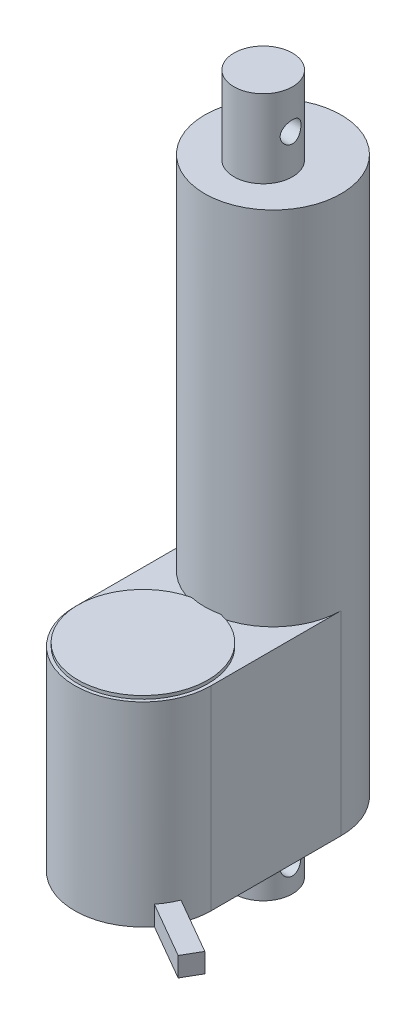
ISO-10303-21;
HEADER;
FILE_DESCRIPTION(('STEP AP214'),'2;1');
FILE_NAME('part.step','',(''),(''),'','','');
FILE_SCHEMA(('AUTOMOTIVE_DESIGN { 1 0 10303 214 1 1 1 1 }'));
ENDSEC;
DATA;
#1=APPLICATION_CONTEXT('core data for automotive mechanical design processes');
#2=APPLICATION_PROTOCOL_DEFINITION('international standard','automotive_design',2000,#1);
#3=PRODUCT_CONTEXT('',#1,'mechanical');
#4=PRODUCT('Part','Part','',(#3));
#5=PRODUCT_RELATED_PRODUCT_CATEGORY('part','',(#4));
#6=PRODUCT_DEFINITION_FORMATION('','',#4);
#7=PRODUCT_DEFINITION_CONTEXT('part definition',#1,'design');
#8=PRODUCT_DEFINITION('design','',#6,#7);
#9=PRODUCT_DEFINITION_SHAPE('','',#8);
#10=(LENGTH_UNIT() NAMED_UNIT(*) SI_UNIT(.MILLI.,.METRE.));
#11=(NAMED_UNIT(*) PLANE_ANGLE_UNIT() SI_UNIT($,.RADIAN.));
#12=(NAMED_UNIT(*) SI_UNIT($,.STERADIAN.) SOLID_ANGLE_UNIT());
#13=UNCERTAINTY_MEASURE_WITH_UNIT(LENGTH_MEASURE(1.E-05),#10,'distance_accuracy_value','');
#14=(GEOMETRIC_REPRESENTATION_CONTEXT(3) GLOBAL_UNCERTAINTY_ASSIGNED_CONTEXT((#13)) GLOBAL_UNIT_ASSIGNED_CONTEXT((#10,
#11,#12)) REPRESENTATION_CONTEXT('',''));
#15=CARTESIAN_POINT('',(0.,0.,0.));
#16=DIRECTION('',(0.,0.,1.));
#17=DIRECTION('',(1.,0.,0.));
#18=AXIS2_PLACEMENT_3D('',#15,#16,#17);
#19=CARTESIAN_POINT('',(0.,61.,40.));
#20=DIRECTION('',(0.,-1.,0.));
#21=DIRECTION('',(0.,0.,-1.));
#22=AXIS2_PLACEMENT_3D('',#19,#20,#21);
#23=CYLINDRICAL_SURFACE('',#22,20.);
#24=DIRECTION('',(0.,-1.,0.));
#25=VECTOR('',#24,1.);
#26=CARTESIAN_POINT('',(4.49859353020479,60.5000000000001,20.5125));
#27=LINE('',#26,#25);
#28=CARTESIAN_POINT('',(4.49859353020479,61.,20.5125));
#29=VERTEX_POINT('',#28);
#30=CARTESIAN_POINT('',(4.49859353020479,60.,20.5125));
#31=VERTEX_POINT('',#30);
#32=EDGE_CURVE('E168',#29,#31,#27,.T.);
#33=ORIENTED_EDGE('',*,*,#32,.F.);
#34=CARTESIAN_POINT('',(0.,61.,40.));
#35=DIRECTION('',(0.,1.,0.));
#36=DIRECTION('',(0.,0.,1.));
#37=AXIS2_PLACEMENT_3D('',#34,#35,#36);
#38=CIRCLE('',#37,20.);
#39=CARTESIAN_POINT('',(-4.49859353020478,61.,20.5125));
#40=VERTEX_POINT('',#39);
#41=EDGE_CURVE('E171',#40,#29,#38,.T.);
#42=ORIENTED_EDGE('',*,*,#41,.F.);
#43=DIRECTION('',(0.,-1.,0.));
#44=VECTOR('',#43,1.);
#45=CARTESIAN_POINT('',(-4.49859353020478,60.5000000000001,20.5125));
#46=LINE('',#45,#44);
#47=CARTESIAN_POINT('',(-4.49859353020479,60.,20.5125));
#48=VERTEX_POINT('',#47);
#49=EDGE_CURVE('E166',#48,#40,#46,.F.);
#50=ORIENTED_EDGE('',*,*,#49,.F.);
#51=CARTESIAN_POINT('',(0.,60.,40.));
#52=DIRECTION('',(0.,1.,0.));
#53=DIRECTION('',(0.,0.,1.));
#54=AXIS2_PLACEMENT_3D('',#51,#52,#53);
#55=CIRCLE('',#54,20.);
#56=EDGE_CURVE('E170',#48,#31,#55,.T.);
#57=ORIENTED_EDGE('',*,*,#56,.T.);
#58=EDGE_LOOP('',(#33,#42,#50,#57));
#59=FACE_BOUND('',#58,.T.);
#60=ADVANCED_FACE('F39',(#59),#23,.T.);
#61=CARTESIAN_POINT('',(0.,60.,0.));
#62=DIRECTION('',(0.,-1.,0.));
#63=DIRECTION('',(0.,0.,-1.));
#64=AXIS2_PLACEMENT_3D('',#61,#62,#63);
#65=CYLINDRICAL_SURFACE('',#64,21.);
#66=CARTESIAN_POINT('',(0.,0.,0.));
#67=DIRECTION('',(0.,1.,0.));
#68=DIRECTION('',(0.,0.,1.));
#69=AXIS2_PLACEMENT_3D('',#66,#67,#68);
#70=CIRCLE('',#69,21.);
#71=CARTESIAN_POINT('',(21.,0.,0.));
#72=VERTEX_POINT('',#71);
#73=CARTESIAN_POINT('',(-21.,0.,0.));
#74=VERTEX_POINT('',#73);
#75=EDGE_CURVE('E174',#72,#74,#70,.T.);
#76=ORIENTED_EDGE('',*,*,#75,.T.);
#77=DIRECTION('',(0.,-1.,0.));
#78=VECTOR('',#77,1.);
#79=CARTESIAN_POINT('',(-21.,60.,0.));
#80=LINE('',#79,#78);
#81=CARTESIAN_POINT('',(-21.,60.,0.));
#82=VERTEX_POINT('',#81);
#83=EDGE_CURVE('E202',#82,#74,#80,.T.);
#84=ORIENTED_EDGE('',*,*,#83,.F.);
#85=CARTESIAN_POINT('',(0.,60.,0.));
#86=DIRECTION('',(0.,1.,0.));
#87=DIRECTION('',(0.,0.,1.));
#88=AXIS2_PLACEMENT_3D('',#85,#86,#87);
#89=CIRCLE('',#88,21.);
#90=EDGE_CURVE('E159',#82,#48,#89,.T.);
#91=ORIENTED_EDGE('',*,*,#90,.T.);
#92=ORIENTED_EDGE('',*,*,#49,.T.);
#93=CARTESIAN_POINT('',(0.,61.,0.));
#94=DIRECTION('',(0.,1.,0.));
#95=DIRECTION('',(0.,0.,1.));
#96=AXIS2_PLACEMENT_3D('',#93,#94,#95);
#97=CIRCLE('',#96,21.);
#98=EDGE_CURVE('E205',#29,#40,#97,.F.);
#99=ORIENTED_EDGE('',*,*,#98,.F.);
#100=ORIENTED_EDGE('',*,*,#32,.T.);
#101=CARTESIAN_POINT('',(21.,60.,0.));
#102=VERTEX_POINT('',#101);
#103=EDGE_CURVE('E161',#31,#102,#89,.T.);
#104=ORIENTED_EDGE('',*,*,#103,.T.);
#105=DIRECTION('',(0.,-1.,0.));
#106=VECTOR('',#105,1.);
#107=CARTESIAN_POINT('',(21.,60.,0.));
#108=LINE('',#107,#106);
#109=EDGE_CURVE('E185',#102,#72,#108,.T.);
#110=ORIENTED_EDGE('',*,*,#109,.T.);
#111=EDGE_LOOP('',(#76,#84,#91,#92,#99,#100,#104,#110));
#112=FACE_BOUND('',#111,.T.);
#113=CARTESIAN_POINT('',(0.,171.072,0.));
#114=DIRECTION('',(0.,1.,0.));
#115=DIRECTION('',(0.,0.,1.));
#116=AXIS2_PLACEMENT_3D('',#113,#114,#115);
#117=CIRCLE('',#116,21.);
#118=CARTESIAN_POINT('',(0.,171.072,21.));
#119=VERTEX_POINT('',#118);
#120=EDGE_CURVE('E163',#119,#119,#117,.T.);
#121=ORIENTED_EDGE('',*,*,#120,.F.);
#122=EDGE_LOOP('',(#121));
#123=FACE_BOUND('',#122,.T.);
#124=ADVANCED_FACE('F41',(#112,#123),#65,.T.);
#125=CARTESIAN_POINT('',(-21.,60.,0.));
#126=DIRECTION('',(1.,0.,0.));
#127=DIRECTION('',(0.,0.,-1.));
#128=AXIS2_PLACEMENT_3D('',#125,#126,#127);
#129=PLANE('',#128);
#130=DIRECTION('',(0.,0.,1.));
#131=VECTOR('',#130,1.);
#132=CARTESIAN_POINT('',(-21.,0.,0.));
#133=LINE('',#132,#131);
#134=CARTESIAN_POINT('',(-21.,0.,40.));
#135=VERTEX_POINT('',#134);
#136=EDGE_CURVE('E188',#74,#135,#133,.T.);
#137=ORIENTED_EDGE('',*,*,#136,.T.);
#138=DIRECTION('',(0.,-1.,0.));
#139=VECTOR('',#138,1.);
#140=CARTESIAN_POINT('',(-21.,60.,40.));
#141=LINE('',#140,#139);
#142=CARTESIAN_POINT('',(-21.,60.,40.));
#143=VERTEX_POINT('',#142);
#144=EDGE_CURVE('E199',#143,#135,#141,.T.);
#145=ORIENTED_EDGE('',*,*,#144,.F.);
#146=DIRECTION('',(0.,0.,1.));
#147=VECTOR('',#146,1.);
#148=CARTESIAN_POINT('',(-21.,60.,0.));
#149=LINE('',#148,#147);
#150=EDGE_CURVE('E177',#82,#143,#149,.T.);
#151=ORIENTED_EDGE('',*,*,#150,.F.);
#152=ORIENTED_EDGE('',*,*,#83,.T.);
#153=EDGE_LOOP('',(#137,#145,#151,#152));
#154=FACE_BOUND('',#153,.T.);
#155=ADVANCED_FACE('F246',(#154),#129,.F.);
#156=CARTESIAN_POINT('',(0.,60.,40.));
#157=DIRECTION('',(0.,-1.,0.));
#158=DIRECTION('',(0.,0.,-1.));
#159=AXIS2_PLACEMENT_3D('',#156,#157,#158);
#160=CYLINDRICAL_SURFACE('',#159,21.);
#161=CARTESIAN_POINT('',(0.,0.,40.));
#162=DIRECTION('',(0.,1.,0.));
#163=DIRECTION('',(0.,0.,1.));
#164=AXIS2_PLACEMENT_3D('',#161,#162,#163);
#165=CIRCLE('',#164,21.);
#166=CARTESIAN_POINT('',(16.5,0.,52.9903810567665));
#167=VERTEX_POINT('',#166);
#168=EDGE_CURVE('E191',#135,#167,#165,.T.);
#169=ORIENTED_EDGE('',*,*,#168,.T.);
#170=DIRECTION('',(0.,-1.,0.));
#171=VECTOR('',#170,1.);
#172=CARTESIAN_POINT('',(16.5,6.,52.9903810567665));
#173=LINE('',#172,#171);
#174=CARTESIAN_POINT('',(16.5,6.,52.9903810567665));
#175=VERTEX_POINT('',#174);
#176=EDGE_CURVE('E54',#175,#167,#173,.T.);
#177=ORIENTED_EDGE('',*,*,#176,.F.);
#178=CARTESIAN_POINT('',(0.,6.,40.));
#179=DIRECTION('',(0.,-1.,0.));
#180=DIRECTION('',(0.,0.,-1.));
#181=AXIS2_PLACEMENT_3D('',#178,#179,#180);
#182=CIRCLE('',#181,21.);
#183=CARTESIAN_POINT('',(19.5,6.,47.7942286340599));
#184=VERTEX_POINT('',#183);
#185=EDGE_CURVE('E12',#184,#175,#182,.T.);
#186=ORIENTED_EDGE('',*,*,#185,.F.);
#187=DIRECTION('',(0.,-1.,0.));
#188=VECTOR('',#187,1.);
#189=CARTESIAN_POINT('',(19.5,6.,47.7942286340599));
#190=LINE('',#189,#188);
#191=CARTESIAN_POINT('',(19.5,0.,47.7942286340599));
#192=VERTEX_POINT('',#191);
#193=EDGE_CURVE('E125',#184,#192,#190,.T.);
#194=ORIENTED_EDGE('',*,*,#193,.T.);
#195=CARTESIAN_POINT('',(21.,0.,40.));
#196=VERTEX_POINT('',#195);
#197=EDGE_CURVE('E190',#192,#196,#165,.T.);
#198=ORIENTED_EDGE('',*,*,#197,.T.);
#199=DIRECTION('',(0.,-1.,0.));
#200=VECTOR('',#199,1.);
#201=CARTESIAN_POINT('',(21.,60.,40.));
#202=LINE('',#201,#200);
#203=CARTESIAN_POINT('',(21.,60.,40.));
#204=VERTEX_POINT('',#203);
#205=EDGE_CURVE('E196',#204,#196,#202,.T.);
#206=ORIENTED_EDGE('',*,*,#205,.F.);
#207=CARTESIAN_POINT('',(0.,60.,40.));
#208=DIRECTION('',(0.,1.,0.));
#209=DIRECTION('',(0.,0.,1.));
#210=AXIS2_PLACEMENT_3D('',#207,#208,#209);
#211=CIRCLE('',#210,21.);
#212=EDGE_CURVE('E179',#143,#204,#211,.T.);
#213=ORIENTED_EDGE('',*,*,#212,.F.);
#214=ORIENTED_EDGE('',*,*,#144,.T.);
#215=EDGE_LOOP('',(#169,#177,#186,#194,#198,#206,#213,#214));
#216=FACE_BOUND('',#215,.T.);
#217=ADVANCED_FACE('F263',(#216),#160,.T.);
#218=CARTESIAN_POINT('',(21.,60.,0.));
#219=DIRECTION('',(-1.,0.,0.));
#220=DIRECTION('',(0.,0.,1.));
#221=AXIS2_PLACEMENT_3D('',#218,#219,#220);
#222=PLANE('',#221);
#223=DIRECTION('',(0.,0.,-1.));
#224=VECTOR('',#223,1.);
#225=CARTESIAN_POINT('',(21.,0.,0.));
#226=LINE('',#225,#224);
#227=EDGE_CURVE('E180',#196,#72,#226,.T.);
#228=ORIENTED_EDGE('',*,*,#227,.T.);
#229=ORIENTED_EDGE('',*,*,#109,.F.);
#230=DIRECTION('',(0.,0.,-1.));
#231=VECTOR('',#230,1.);
#232=CARTESIAN_POINT('',(21.,60.,0.));
#233=LINE('',#232,#231);
#234=EDGE_CURVE('E182',#204,#102,#233,.T.);
#235=ORIENTED_EDGE('',*,*,#234,.F.);
#236=ORIENTED_EDGE('',*,*,#205,.T.);
#237=EDGE_LOOP('',(#228,#229,#235,#236));
#238=FACE_BOUND('',#237,.T.);
#239=ADVANCED_FACE('F256',(#238),#222,.F.);
#240=CARTESIAN_POINT('',(0.,60.,0.));
#241=DIRECTION('',(0.,1.,0.));
#242=DIRECTION('',(0.,0.,1.));
#243=AXIS2_PLACEMENT_3D('',#240,#241,#242);
#244=PLANE('',#243);
#245=ORIENTED_EDGE('',*,*,#56,.F.);
#246=ORIENTED_EDGE('',*,*,#90,.F.);
#247=ORIENTED_EDGE('',*,*,#150,.T.);
#248=ORIENTED_EDGE('',*,*,#212,.T.);
#249=ORIENTED_EDGE('',*,*,#234,.T.);
#250=ORIENTED_EDGE('',*,*,#103,.F.);
#251=EDGE_LOOP('',(#245,#246,#247,#248,#249,#250));
#252=FACE_BOUND('',#251,.T.);
#253=ADVANCED_FACE('F252',(#252),#244,.T.);
#254=CARTESIAN_POINT('',(0.,0.,0.));
#255=DIRECTION('',(0.,1.,0.));
#256=DIRECTION('',(0.,0.,1.));
#257=AXIS2_PLACEMENT_3D('',#254,#255,#256);
#258=PLANE('',#257);
#259=CARTESIAN_POINT('',(0.,0.,3.));
#260=DIRECTION('',(0.,1.,0.));
#261=DIRECTION('',(0.,0.,1.));
#262=AXIS2_PLACEMENT_3D('',#259,#260,#261);
#263=CIRCLE('',#262,9.);
#264=CARTESIAN_POINT('',(0.,0.,12.));
#265=VERTEX_POINT('',#264);
#266=EDGE_CURVE('E155',#265,#265,#263,.F.);
#267=ORIENTED_EDGE('',*,*,#266,.F.);
#268=EDGE_LOOP('',(#267));
#269=FACE_BOUND('',#268,.T.);
#270=ORIENTED_EDGE('',*,*,#197,.F.);
#271=DIRECTION('',(0.86602540378444,0.,0.499999999999998));
#272=VECTOR('',#271,1.);
#273=CARTESIAN_POINT('',(19.5,0.,47.7942286340599));
#274=LINE('',#273,#272);
#275=CARTESIAN_POINT('',(36.8205080756888,0.,57.7942286340599));
#276=VERTEX_POINT('',#275);
#277=EDGE_CURVE('E141',#192,#276,#274,.T.);
#278=ORIENTED_EDGE('',*,*,#277,.T.);
#279=DIRECTION('',(-0.499999999999999,0.,0.866025403784439));
#280=VECTOR('',#279,1.);
#281=CARTESIAN_POINT('',(36.8205080756888,0.,57.7942286340599));
#282=LINE('',#281,#280);
#283=CARTESIAN_POINT('',(33.8205080756888,0.,62.9903810567665));
#284=VERTEX_POINT('',#283);
#285=EDGE_CURVE('E119',#276,#284,#282,.T.);
#286=ORIENTED_EDGE('',*,*,#285,.T.);
#287=DIRECTION('',(-0.866025403784439,0.,-0.499999999999999));
#288=VECTOR('',#287,1.);
#289=CARTESIAN_POINT('',(33.8205080756888,0.,62.9903810567665));
#290=LINE('',#289,#288);
#291=EDGE_CURVE('E135',#284,#167,#290,.T.);
#292=ORIENTED_EDGE('',*,*,#291,.T.);
#293=ORIENTED_EDGE('',*,*,#168,.F.);
#294=ORIENTED_EDGE('',*,*,#136,.F.);
#295=ORIENTED_EDGE('',*,*,#75,.F.);
#296=ORIENTED_EDGE('',*,*,#227,.F.);
#297=EDGE_LOOP('',(#270,#278,#286,#292,#293,#294,#295,#296));
#298=FACE_BOUND('',#297,.T.);
#299=ADVANCED_FACE('F255',(#269,#298),#258,.F.);
#300=CARTESIAN_POINT('',(0.,61.,40.));
#301=DIRECTION('',(0.,1.,0.));
#302=DIRECTION('',(0.,0.,1.));
#303=AXIS2_PLACEMENT_3D('',#300,#301,#302);
#304=PLANE('',#303);
#305=ORIENTED_EDGE('',*,*,#41,.T.);
#306=ORIENTED_EDGE('',*,*,#98,.T.);
#307=EDGE_LOOP('',(#305,#306));
#308=FACE_BOUND('',#307,.T.);
#309=ADVANCED_FACE('F251',(#308),#304,.T.);
#310=CARTESIAN_POINT('',(0.,171.072,0.));
#311=DIRECTION('',(0.,1.,0.));
#312=DIRECTION('',(0.,0.,1.));
#313=AXIS2_PLACEMENT_3D('',#310,#311,#312);
#314=PLANE('',#313);
#315=CARTESIAN_POINT('',(0.,171.072,3.));
#316=DIRECTION('',(0.,1.,0.));
#317=DIRECTION('',(0.,0.,1.));
#318=AXIS2_PLACEMENT_3D('',#315,#316,#317);
#319=CIRCLE('',#318,9.);
#320=CARTESIAN_POINT('',(0.,171.072,12.));
#321=VERTEX_POINT('',#320);
#322=EDGE_CURVE('E47',#321,#321,#319,.T.);
#323=ORIENTED_EDGE('',*,*,#322,.F.);
#324=EDGE_LOOP('',(#323));
#325=FACE_BOUND('',#324,.T.);
#326=ORIENTED_EDGE('',*,*,#120,.T.);
#327=EDGE_LOOP('',(#326));
#328=FACE_BOUND('',#327,.T.);
#329=ADVANCED_FACE('F238',(#325,#328),#314,.T.);
#330=CARTESIAN_POINT('',(0.,-20.,3.));
#331=DIRECTION('',(0.,1.,0.));
#332=DIRECTION('',(0.,0.,1.));
#333=AXIS2_PLACEMENT_3D('',#330,#331,#332);
#334=CYLINDRICAL_SURFACE('',#333,9.);
#335=CARTESIAN_POINT('',(8.41189633792523,-12.,6.2));
#336=CARTESIAN_POINT('',(8.4118932650466,-11.8264685256566,6.20000353307752));
#337=CARTESIAN_POINT('',(8.41732460634632,-11.652961535078,6.18583708607493));
#338=CARTESIAN_POINT('',(8.43833007259956,-11.3111356423042,6.12977098776784));
#339=CARTESIAN_POINT('',(8.45390477362794,-11.1428170353431,6.0878697613115));
#340=CARTESIAN_POINT('',(8.49321451998594,-10.8163860017398,5.97803065160682));
#341=CARTESIAN_POINT('',(8.51693174350373,-10.6582521736158,5.91014959434596));
#342=CARTESIAN_POINT('',(8.56982685507572,-10.3555597175907,5.7504758647763));
#343=CARTESIAN_POINT('',(8.59900618968186,-10.2110047010842,5.65867685565444));
#344=CARTESIAN_POINT('',(8.66099643431208,-9.9331268409025,5.44938794395709));
#345=CARTESIAN_POINT('',(8.69390659013414,-9.80049652068232,5.33100772454371));
#346=CARTESIAN_POINT('',(8.75881730105317,-9.55649031632278,5.07381108794116));
#347=CARTESIAN_POINT('',(8.79081768533042,-9.44511840154581,4.93499086275586));
#348=CARTESIAN_POINT('',(8.85146819440577,-9.24354838604989,4.63569075649184));
#349=CARTESIAN_POINT('',(8.87998820395507,-9.15408999915664,4.47468398759006));
#350=CARTESIAN_POINT('',(8.92928300808076,-9.003809258893,4.13871589346517));
#351=CARTESIAN_POINT('',(8.95006019801533,-8.94297804774028,3.96375890432082));
#352=CARTESIAN_POINT('',(8.98082460927428,-8.85406842798144,3.61212817270329));
#353=CARTESIAN_POINT('',(8.99120253424357,-8.82480061173588,3.43579000699278));
#354=CARTESIAN_POINT('',(9.00139391640714,-8.79605155900545,3.08042020678262));
#355=CARTESIAN_POINT('',(9.00121046439902,-8.79656160799898,2.90138937562759));
#356=CARTESIAN_POINT('',(8.99055613048662,-8.82663139478012,2.55419008068555));
#357=CARTESIAN_POINT('',(8.98054388382299,-8.85489605224494,2.38589300464871));
#358=CARTESIAN_POINT('',(8.9519461344512,-8.93751196280798,2.05660844009956));
#359=CARTESIAN_POINT('',(8.93336003405548,-8.9918650345531,1.89562146203733));
#360=CARTESIAN_POINT('',(8.88915366964931,-9.12578891250598,1.58286892128717));
#361=CARTESIAN_POINT('',(8.86343876380728,-9.20570140958482,1.43126360402289));
#362=CARTESIAN_POINT('',(8.80761312260906,-9.38818401866893,1.14325464166603));
#363=CARTESIAN_POINT('',(8.77750105608247,-9.4907609968272,1.0068556221675));
#364=CARTESIAN_POINT('',(8.71413229165615,-9.7220406253599,0.745461174698835));
#365=CARTESIAN_POINT('',(8.68079351747775,-9.85184113855191,0.621455557969808));
#366=CARTESIAN_POINT('',(8.61604047941977,-10.130638941856,0.396623758379142));
#367=CARTESIAN_POINT('',(8.58462660431867,-10.2796400912528,0.295802246845453));
#368=CARTESIAN_POINT('',(8.52679453622307,-10.596141695659,0.118567027302704));
#369=CARTESIAN_POINT('',(8.50047751774492,-10.7639291580988,0.0426302402624518));
#370=CARTESIAN_POINT('',(8.45698550871302,-11.111087928832,-0.079553931606583));
#371=CARTESIAN_POINT('',(8.43980604422681,-11.2904535199079,-0.125815848145954));
#372=CARTESIAN_POINT('',(8.41756872357773,-11.6459823203911,-0.185199752218625));
#373=CARTESIAN_POINT('',(8.41194276921274,-11.8218501546845,-0.199876693341481));
#374=CARTESIAN_POINT('',(8.41185052489193,-12.1735877525775,-0.200121681172969));
#375=CARTESIAN_POINT('',(8.41738183186827,-12.349457507605,-0.185695996049232));
#376=CARTESIAN_POINT('',(8.43840881759181,-12.6886770089979,-0.129549554957942));
#377=CARTESIAN_POINT('',(8.4534871623837,-12.8522445301269,-0.0889707703608892));
#378=CARTESIAN_POINT('',(8.49143139036941,-13.1701957627923,0.0169253763553486));
#379=CARTESIAN_POINT('',(8.51429876909984,-13.3245777039558,0.082247489597481));
#380=CARTESIAN_POINT('',(8.56622856712809,-13.6257514578537,0.238351838433968));
#381=CARTESIAN_POINT('',(8.59547919151321,-13.7720909316696,0.329942391588259));
#382=CARTESIAN_POINT('',(8.65654052054043,-14.0478808180739,0.535097448547576));
#383=CARTESIAN_POINT('',(8.68835207521352,-14.1773255852437,0.648669266144519));
#384=CARTESIAN_POINT('',(8.75310212329806,-14.4231492145465,0.902092316430174));
#385=CARTESIAN_POINT('',(8.78600413306493,-14.5383923585935,1.04305809402647));
#386=CARTESIAN_POINT('',(8.8474990652048,-14.7436938809285,1.34313989717756));
#387=CARTESIAN_POINT('',(8.8760920661368,-14.8337527183857,1.50225559174207));
#388=CARTESIAN_POINT('',(8.92566491913936,-14.9854011476803,1.83364055235568));
#389=CARTESIAN_POINT('',(8.94668397871934,-15.0471378208215,2.00583632265923));
#390=CARTESIAN_POINT('',(8.97889787111404,-15.1404695217594,2.35907487208383));
#391=CARTESIAN_POINT('',(8.99009679974136,-15.1720771163709,2.54011392952431));
#392=CARTESIAN_POINT('',(9.00105791661002,-15.2030032701476,2.89557877592596));
#393=CARTESIAN_POINT('',(9.00139422936001,-15.2039427674164,3.06984722202557));
#394=CARTESIAN_POINT('',(8.99204917489086,-15.1775935320361,3.41594538826768));
#395=CARTESIAN_POINT('',(8.98236881739509,-15.1503076446271,3.5877753524498));
#396=CARTESIAN_POINT('',(8.95431705598183,-15.0693950404601,3.92063769954396));
#397=CARTESIAN_POINT('',(8.93612442611881,-15.0163093210802,4.0818177668919));
#398=CARTESIAN_POINT('',(8.89292959106223,-14.8858231020553,4.39302220076692));
#399=CARTESIAN_POINT('',(8.86792611198807,-14.8084180533806,4.5430444736848));
#400=CARTESIAN_POINT('',(8.81240737631813,-14.6279596453266,4.83420921629506));
#401=CARTESIAN_POINT('',(8.78171215871384,-14.5240069957271,4.97475945229623));
#402=CARTESIAN_POINT('',(8.71861966525215,-14.2948739883672,5.23693688929652));
#403=CARTESIAN_POINT('',(8.68622181276928,-14.169686406653,5.35855762354078));
#404=CARTESIAN_POINT('',(8.62156766762374,-13.8947459009872,5.58517107793544));
#405=CARTESIAN_POINT('',(8.58938697508821,-13.7441256419717,5.68913680250308));
#406=CARTESIAN_POINT('',(8.53057426655424,-13.4265324794094,5.87026308230696));
#407=CARTESIAN_POINT('',(8.50394179822592,-13.2595609105681,5.94742582305175));
#408=CARTESIAN_POINT('',(8.45962884411624,-12.913623127686,6.0723142980175));
#409=CARTESIAN_POINT('',(8.44195484664723,-12.7346483260425,6.12001870202119));
#410=CARTESIAN_POINT('',(8.41809304559278,-12.3704376459497,6.18385193666275));
#411=CARTESIAN_POINT('',(8.41189961751539,-12.1852048786807,6.19999622925354));
#412=CARTESIAN_POINT('',(8.41189633792523,-12.,6.2));
#413=B_SPLINE_CURVE_WITH_KNOTS('',3,(#335,#336,#337,#338,#339,#340,#341,#342,#343,#344,#345,
#346,#347,#348,#349,#350,#351,#352,#353,#354,#355,#356,#357,#358,#359,#360,#361,#362,#363,#364,
#365,#366,#367,#368,#369,#370,#371,#372,#373,#374,#375,#376,#377,#378,#379,#380,#381,#382,#383,
#384,#385,#386,#387,#388,#389,#390,#391,#392,#393,#394,#395,#396,#397,#398,#399,#400,#401,#402,
#403,#404,#405,#406,#407,#408,#409,#410,#411,#412),.UNSPECIFIED.,.T.,.F.,(4,2,2,2,2,2,2,2,2,2,2,
2,2,2,2,2,2,2,2,2,2,2,2,2,2,2,2,2,2,2,2,2,2,2,2,2,2,2,4),(0.,0.519906583940629,1.0398426976668,
1.55864798921435,2.07759087285571,2.61756257067268,3.15763499340924,3.71399222157022,
4.27017718905266,4.80458010720068,5.33882663259256,5.84927423084734,6.35975741803391,
6.87737219998848,7.39514400769396,7.94040326796416,8.48577229556618,9.04105349668463,
9.59606256996586,10.1230560329917,10.6499360034867,11.1552393556713,11.6606397835721,
12.1836622999796,12.7068591409579,13.2593187125066,13.8117682107572,14.3613153417132,
14.9106331565694,15.4308674027603,15.9510492122138,16.4607654533149,16.9705770957373,
17.500708029829,18.0310196732495,18.5858162818141,19.1405676417779,19.6957202170115,
20.2506007432583),.UNSPECIFIED.);
#414=CARTESIAN_POINT('',(8.41189633792523,-12.,6.2));
#415=VERTEX_POINT('',#414);
#416=EDGE_CURVE('E160',#415,#415,#413,.T.);
#417=ORIENTED_EDGE('',*,*,#416,.T.);
#418=EDGE_LOOP('',(#417));
#419=FACE_BOUND('',#418,.T.);
#420=CARTESIAN_POINT('',(-8.41189633792523,-12.,6.2));
#421=CARTESIAN_POINT('',(-8.4118932650466,-12.1735314743434,6.20000353307752));
#422=CARTESIAN_POINT('',(-8.41732460634632,-12.347038464922,6.18583708607493));
#423=CARTESIAN_POINT('',(-8.43833007259956,-12.6888643576958,6.12977098776784));
#424=CARTESIAN_POINT('',(-8.45390477362794,-12.8571829646569,6.0878697613115));
#425=CARTESIAN_POINT('',(-8.49321451998593,-13.1836139982602,5.97803065160682));
#426=CARTESIAN_POINT('',(-8.51693174350373,-13.3417478263842,5.91014959434596));
#427=CARTESIAN_POINT('',(-8.56982685507572,-13.6444402824093,5.7504758647763));
#428=CARTESIAN_POINT('',(-8.59900618968186,-13.7889952989158,5.65867685565444));
#429=CARTESIAN_POINT('',(-8.66099643431208,-14.0668731590975,5.44938794395709));
#430=CARTESIAN_POINT('',(-8.69390659013415,-14.1995034793177,5.33100772454371));
#431=CARTESIAN_POINT('',(-8.75881730105317,-14.4435096836772,5.07381108794116));
#432=CARTESIAN_POINT('',(-8.79081768533042,-14.5548815984542,4.93499086275586));
#433=CARTESIAN_POINT('',(-8.85146819440577,-14.7564516139501,4.63569075649184));
#434=CARTESIAN_POINT('',(-8.87998820395508,-14.8459100008434,4.47468398759006));
#435=CARTESIAN_POINT('',(-8.92928300808076,-14.996190741107,4.13871589346517));
#436=CARTESIAN_POINT('',(-8.95006019801533,-15.0570219522597,3.96375890432082));
#437=CARTESIAN_POINT('',(-8.98082460927428,-15.1459315720186,3.61212817270329));
#438=CARTESIAN_POINT('',(-8.99120253424357,-15.1751993882641,3.43579000699277));
#439=CARTESIAN_POINT('',(-9.00139391640714,-15.2039484409945,3.08042020678262));
#440=CARTESIAN_POINT('',(-9.00121046439902,-15.203438392001,2.90138937562759));
#441=CARTESIAN_POINT('',(-8.99055613048662,-15.1733686052199,2.55419008068555));
#442=CARTESIAN_POINT('',(-8.98054388382299,-15.1451039477551,2.3858930046487));
#443=CARTESIAN_POINT('',(-8.9519461344512,-15.062488037192,2.05660844009956));
#444=CARTESIAN_POINT('',(-8.93336003405548,-15.0081349654469,1.89562146203733));
#445=CARTESIAN_POINT('',(-8.88915366964931,-14.874211087494,1.58286892128717));
#446=CARTESIAN_POINT('',(-8.86343876380728,-14.7942985904152,1.43126360402289));
#447=CARTESIAN_POINT('',(-8.80761312260906,-14.6118159813311,1.14325464166603));
#448=CARTESIAN_POINT('',(-8.77750105608247,-14.5092390031728,1.0068556221675));
#449=CARTESIAN_POINT('',(-8.71413229165615,-14.2779593746401,0.745461174698834));
#450=CARTESIAN_POINT('',(-8.68079351747775,-14.1481588614481,0.621455557969807));
#451=CARTESIAN_POINT('',(-8.61604047941977,-13.869361058144,0.39662375837914));
#452=CARTESIAN_POINT('',(-8.58462660431867,-13.7203599087472,0.295802246845452));
#453=CARTESIAN_POINT('',(-8.52679453622307,-13.403858304341,0.118567027302702));
#454=CARTESIAN_POINT('',(-8.50047751774492,-13.2360708419012,0.0426302402624505));
#455=CARTESIAN_POINT('',(-8.45698550871302,-12.888912071168,-0.0795539316065836));
#456=CARTESIAN_POINT('',(-8.43980604422681,-12.7095464800921,-0.125815848145955));
#457=CARTESIAN_POINT('',(-8.41756872357773,-12.3540176796089,-0.185199752218627));
#458=CARTESIAN_POINT('',(-8.41194276921274,-12.1781498453155,-0.199876693341483));
#459=CARTESIAN_POINT('',(-8.41185052489193,-11.8264122474225,-0.200121681172971));
#460=CARTESIAN_POINT('',(-8.41738183186827,-11.650542492395,-0.185695996049234));
#461=CARTESIAN_POINT('',(-8.43840881759181,-11.3113229910021,-0.129549554957943));
#462=CARTESIAN_POINT('',(-8.4534871623837,-11.1477554698731,-0.0889707703608904));
#463=CARTESIAN_POINT('',(-8.49143139036941,-10.8298042372077,0.0169253763553473));
#464=CARTESIAN_POINT('',(-8.51429876909984,-10.6754222960442,0.0822474895974797));
#465=CARTESIAN_POINT('',(-8.56622856712809,-10.3742485421463,0.238351838433967));
#466=CARTESIAN_POINT('',(-8.59547919151321,-10.2279090683304,0.329942391588258));
#467=CARTESIAN_POINT('',(-8.65654052054043,-9.95211918192605,0.535097448547575));
#468=CARTESIAN_POINT('',(-8.68835207521352,-9.82267441475632,0.648669266144517));
#469=CARTESIAN_POINT('',(-8.75310212329807,-9.57685078545353,0.902092316430172));
#470=CARTESIAN_POINT('',(-8.78600413306493,-9.46160764140646,1.04305809402647));
#471=CARTESIAN_POINT('',(-8.8474990652048,-9.25630611907148,1.34313989717756));
#472=CARTESIAN_POINT('',(-8.8760920661368,-9.16624728161426,1.50225559174207));
#473=CARTESIAN_POINT('',(-8.92566491913936,-9.01459885231972,1.83364055235568));
#474=CARTESIAN_POINT('',(-8.94668397871934,-8.95286217917854,2.00583632265923));
#475=CARTESIAN_POINT('',(-8.97889787111404,-8.85953047824063,2.35907487208383));
#476=CARTESIAN_POINT('',(-8.99009679974136,-8.82792288362913,2.54011392952431));
#477=CARTESIAN_POINT('',(-9.00105791661002,-8.79699672985239,2.89557877592596));
#478=CARTESIAN_POINT('',(-9.00139422936001,-8.79605723258357,3.06984722202557));
#479=CARTESIAN_POINT('',(-8.99204917489086,-8.82240646796386,3.41594538826768));
#480=CARTESIAN_POINT('',(-8.98236881739509,-8.84969235537291,3.5877753524498));
#481=CARTESIAN_POINT('',(-8.95431705598183,-8.93060495953994,3.92063769954396));
#482=CARTESIAN_POINT('',(-8.93612442611881,-8.98369067891976,4.0818177668919));
#483=CARTESIAN_POINT('',(-8.89292959106223,-9.11417689794468,4.39302220076692));
#484=CARTESIAN_POINT('',(-8.86792611198807,-9.19158194661937,4.5430444736848));
#485=CARTESIAN_POINT('',(-8.81240737631813,-9.37204035467338,4.83420921629506));
#486=CARTESIAN_POINT('',(-8.78171215871384,-9.47599300427294,4.97475945229623));
#487=CARTESIAN_POINT('',(-8.71861966525215,-9.70512601163278,5.23693688929651));
#488=CARTESIAN_POINT('',(-8.68622181276928,-9.83031359334698,5.35855762354078));
#489=CARTESIAN_POINT('',(-8.62156766762374,-10.1052540990128,5.58517107793544));
#490=CARTESIAN_POINT('',(-8.58938697508821,-10.2558743580283,5.68913680250308));
#491=CARTESIAN_POINT('',(-8.53057426655424,-10.5734675205906,5.87026308230696));
#492=CARTESIAN_POINT('',(-8.50394179822592,-10.7404390894319,5.94742582305175));
#493=CARTESIAN_POINT('',(-8.45962884411623,-11.086376872314,6.0723142980175));
#494=CARTESIAN_POINT('',(-8.44195484664723,-11.2653516739575,6.12001870202119));
#495=CARTESIAN_POINT('',(-8.41809304559278,-11.6295623540503,6.18385193666274));
#496=CARTESIAN_POINT('',(-8.41189961751539,-11.8147951213193,6.19999622925354));
#497=CARTESIAN_POINT('',(-8.41189633792523,-12.,6.2));
#498=B_SPLINE_CURVE_WITH_KNOTS('',3,(#420,#421,#422,#423,#424,#425,#426,#427,#428,#429,#430,
#431,#432,#433,#434,#435,#436,#437,#438,#439,#440,#441,#442,#443,#444,#445,#446,#447,#448,#449,
#450,#451,#452,#453,#454,#455,#456,#457,#458,#459,#460,#461,#462,#463,#464,#465,#466,#467,#468,
#469,#470,#471,#472,#473,#474,#475,#476,#477,#478,#479,#480,#481,#482,#483,#484,#485,#486,#487,
#488,#489,#490,#491,#492,#493,#494,#495,#496,#497),.UNSPECIFIED.,.T.,.F.,(4,2,2,2,2,2,2,2,2,2,2,
2,2,2,2,2,2,2,2,2,2,2,2,2,2,2,2,2,2,2,2,2,2,2,2,2,2,2,4),(0.,0.51990658394063,1.0398426976668,
1.55864798921435,2.07759087285571,2.61756257067268,3.15763499340924,3.71399222157022,
4.27017718905266,4.80458010720068,5.33882663259256,5.84927423084734,6.35975741803391,
6.87737219998848,7.39514400769396,7.94040326796416,8.48577229556618,9.04105349668463,
9.59606256996586,10.1230560329917,10.6499360034867,11.1552393556713,11.6606397835721,
12.1836622999796,12.7068591409579,13.2593187125066,13.8117682107572,14.3613153417132,
14.9106331565694,15.4308674027603,15.9510492122138,16.4607654533149,16.9705770957373,
17.500708029829,18.0310196732495,18.5858162818141,19.1405676417779,19.6957202170116,
20.2506007432583),.UNSPECIFIED.);
#499=CARTESIAN_POINT('',(-8.41189633792523,-12.,6.2));
#500=VERTEX_POINT('',#499);
#501=EDGE_CURVE('E151',#500,#500,#498,.T.);
#502=ORIENTED_EDGE('',*,*,#501,.T.);
#503=EDGE_LOOP('',(#502));
#504=FACE_BOUND('',#503,.T.);
#505=CARTESIAN_POINT('',(0.,-20.,3.));
#506=DIRECTION('',(0.,-1.,0.));
#507=DIRECTION('',(0.,0.,-1.));
#508=AXIS2_PLACEMENT_3D('',#505,#506,#507);
#509=CIRCLE('',#508,9.);
#510=CARTESIAN_POINT('',(0.,-20.,-6.));
#511=VERTEX_POINT('',#510);
#512=EDGE_CURVE('E156',#511,#511,#509,.T.);
#513=ORIENTED_EDGE('',*,*,#512,.F.);
#514=EDGE_LOOP('',(#513));
#515=FACE_BOUND('',#514,.T.);
#516=ORIENTED_EDGE('',*,*,#266,.T.);
#517=EDGE_LOOP('',(#516));
#518=FACE_BOUND('',#517,.T.);
#519=ADVANCED_FACE('F219',(#419,#504,#515,#518),#334,.T.);
#520=CARTESIAN_POINT('',(0.,-20.,3.));
#521=DIRECTION('',(0.,-1.,0.));
#522=DIRECTION('',(0.,0.,-1.));
#523=AXIS2_PLACEMENT_3D('',#520,#521,#522);
#524=PLANE('',#523);
#525=ORIENTED_EDGE('',*,*,#512,.T.);
#526=EDGE_LOOP('',(#525));
#527=FACE_BOUND('',#526,.T.);
#528=ADVANCED_FACE('F228',(#527),#524,.T.);
#529=CARTESIAN_POINT('',(21.,-12.,3.));
#530=DIRECTION('',(-1.,0.,0.));
#531=DIRECTION('',(0.,0.,1.));
#532=AXIS2_PLACEMENT_3D('',#529,#530,#531);
#533=CYLINDRICAL_SURFACE('',#532,3.2);
#534=ORIENTED_EDGE('',*,*,#501,.F.);
#535=EDGE_LOOP('',(#534));
#536=FACE_BOUND('',#535,.T.);
#537=ORIENTED_EDGE('',*,*,#416,.F.);
#538=EDGE_LOOP('',(#537));
#539=FACE_BOUND('',#538,.T.);
#540=ADVANCED_FACE('F223',(#536,#539),#533,.F.);
#541=CARTESIAN_POINT('',(0.,195.072,3.));
#542=DIRECTION('',(0.,-1.,0.));
#543=DIRECTION('',(0.,0.,-1.));
#544=AXIS2_PLACEMENT_3D('',#541,#542,#543);
#545=CYLINDRICAL_SURFACE('',#544,9.);
#546=CARTESIAN_POINT('',(8.41189633792523,183.072,6.20000000000001));
#547=CARTESIAN_POINT('',(8.4118932650466,183.245531474343,6.20000353307752));
#548=CARTESIAN_POINT('',(8.41732460634632,183.419038464922,6.18583708607493));
#549=CARTESIAN_POINT('',(8.43833007259955,183.760864357696,6.12977098776785));
#550=CARTESIAN_POINT('',(8.45390477362794,183.929182964657,6.08786976131151));
#551=CARTESIAN_POINT('',(8.49321451998594,184.25561399826,5.97803065160682));
#552=CARTESIAN_POINT('',(8.51693174350373,184.413747826384,5.91014959434595));
#553=CARTESIAN_POINT('',(8.56982685507572,184.716440282409,5.75047586477629));
#554=CARTESIAN_POINT('',(8.59900618968186,184.860995298916,5.65867685565444));
#555=CARTESIAN_POINT('',(8.66099643431208,185.138873159098,5.44938794395707));
#556=CARTESIAN_POINT('',(8.69390659013415,185.271503479318,5.3310077245437));
#557=CARTESIAN_POINT('',(8.75881730105317,185.515509683677,5.07381108794115));
#558=CARTESIAN_POINT('',(8.79081768533042,185.626881598454,4.93499086275585));
#559=CARTESIAN_POINT('',(8.85146819440577,185.82845161395,4.63569075649183));
#560=CARTESIAN_POINT('',(8.87998820395508,185.917910000843,4.47468398759004));
#561=CARTESIAN_POINT('',(8.92928300808076,186.068190741107,4.13871589346515));
#562=CARTESIAN_POINT('',(8.95006019801533,186.12902195226,3.9637589043208));
#563=CARTESIAN_POINT('',(8.98082460927428,186.217931572019,3.61212817270327));
#564=CARTESIAN_POINT('',(8.99120253424357,186.247199388264,3.43579000699275));
#565=CARTESIAN_POINT('',(9.00139391640714,186.275948440995,3.0804202067826));
#566=CARTESIAN_POINT('',(9.00121046439902,186.275438392001,2.90138937562757));
#567=CARTESIAN_POINT('',(8.99055613048662,186.24536860522,2.55419008068554));
#568=CARTESIAN_POINT('',(8.98054388382299,186.217103947755,2.38589300464869));
#569=CARTESIAN_POINT('',(8.9519461344512,186.134488037192,2.05660844009954));
#570=CARTESIAN_POINT('',(8.93336003405548,186.080134965447,1.89562146203731));
#571=CARTESIAN_POINT('',(8.8891536696493,185.946211087494,1.58286892128716));
#572=CARTESIAN_POINT('',(8.86343876380727,185.866298590415,1.43126360402287));
#573=CARTESIAN_POINT('',(8.80761312260905,185.683815981331,1.14325464166601));
#574=CARTESIAN_POINT('',(8.77750105608247,185.581239003173,1.00685562216748));
#575=CARTESIAN_POINT('',(8.71413229165615,185.34995937464,0.745461174698821));
#576=CARTESIAN_POINT('',(8.68079351747775,185.220158861448,0.621455557969794));
#577=CARTESIAN_POINT('',(8.61604047941977,184.941361058144,0.396623758379128));
#578=CARTESIAN_POINT('',(8.58462660431867,184.792359908747,0.29580224684544));
#579=CARTESIAN_POINT('',(8.52679453622307,184.475858304341,0.118567027302691));
#580=CARTESIAN_POINT('',(8.50047751774492,184.308070841901,0.0426302402624393));
#581=CARTESIAN_POINT('',(8.45698550871302,183.960912071168,-0.0795539316065918));
#582=CARTESIAN_POINT('',(8.43980604422681,183.781546480092,-0.125815848145963));
#583=CARTESIAN_POINT('',(8.41756872357773,183.426017679609,-0.185199752218634));
#584=CARTESIAN_POINT('',(8.41194276921274,183.250149845315,-0.199876693341487));
#585=CARTESIAN_POINT('',(8.41185052489193,182.898412247422,-0.200121681172972));
#586=CARTESIAN_POINT('',(8.41738183186827,182.722542492395,-0.185695996049235));
#587=CARTESIAN_POINT('',(8.43840881759181,182.383322991002,-0.129549554957944));
#588=CARTESIAN_POINT('',(8.4534871623837,182.219755469873,-0.0889707703608889));
#589=CARTESIAN_POINT('',(8.49143139036941,181.901804237208,0.0169253763553533));
#590=CARTESIAN_POINT('',(8.51429876909984,181.747422296044,0.0822474895974865));
#591=CARTESIAN_POINT('',(8.56622856712808,181.446248542146,0.238351838433966));
#592=CARTESIAN_POINT('',(8.5954791915132,181.29990906833,0.329942391588249));
#593=CARTESIAN_POINT('',(8.65654052054042,181.024119181926,0.535097448547562));
#594=CARTESIAN_POINT('',(8.68835207521351,180.894674414756,0.648669266144511));
#595=CARTESIAN_POINT('',(8.75310212329806,180.648850785454,0.902092316430169));
#596=CARTESIAN_POINT('',(8.78600413306493,180.533607641406,1.04305809402647));
#597=CARTESIAN_POINT('',(8.84749906520479,180.328306119071,1.34313989717756));
#598=CARTESIAN_POINT('',(8.8760920661368,180.238247281614,1.50225559174207));
#599=CARTESIAN_POINT('',(8.92566491913936,180.08659885232,1.83364055235569));
#600=CARTESIAN_POINT('',(8.94668397871934,180.024862179179,2.00583632265924));
#601=CARTESIAN_POINT('',(8.97889787111404,179.931530478241,2.35907487208384));
#602=CARTESIAN_POINT('',(8.99009679974136,179.899922883629,2.54011392952432));
#603=CARTESIAN_POINT('',(9.00105791661002,179.868996729852,2.89557877592597));
#604=CARTESIAN_POINT('',(9.00139422936001,179.868057232584,3.06984722202559));
#605=CARTESIAN_POINT('',(8.99204917489086,179.894406467964,3.4159453882677));
#606=CARTESIAN_POINT('',(8.98236881739509,179.921692355373,3.58777535244981));
#607=CARTESIAN_POINT('',(8.95431705598183,180.00260495954,3.92063769954398));
#608=CARTESIAN_POINT('',(8.9361244261188,180.05569067892,4.08181776689193));
#609=CARTESIAN_POINT('',(8.89292959106223,180.186176897945,4.39302220076695));
#610=CARTESIAN_POINT('',(8.86792611198806,180.263581946619,4.54304447368483));
#611=CARTESIAN_POINT('',(8.81240737631813,180.444040354673,4.83420921629508));
#612=CARTESIAN_POINT('',(8.78171215871384,180.547993004273,4.97475945229624));
#613=CARTESIAN_POINT('',(8.71861966525214,180.777126011633,5.23693688929653));
#614=CARTESIAN_POINT('',(8.68622181276928,180.902313593347,5.35855762354079));
#615=CARTESIAN_POINT('',(8.62156766762374,181.177254099013,5.58517107793545));
#616=CARTESIAN_POINT('',(8.5893869750882,181.327874358028,5.68913680250308));
#617=CARTESIAN_POINT('',(8.53057426655424,181.645467520591,5.87026308230697));
#618=CARTESIAN_POINT('',(8.50394179822592,181.812439089432,5.94742582305176));
#619=CARTESIAN_POINT('',(8.45962884411623,182.158376872314,6.07231429801751));
#620=CARTESIAN_POINT('',(8.44195484664722,182.337351673957,6.1200187020212));
#621=CARTESIAN_POINT('',(8.41809304559277,182.70156235405,6.18385193666275));
#622=CARTESIAN_POINT('',(8.41189961751539,182.886795121319,6.19999622925355));
#623=CARTESIAN_POINT('',(8.41189633792523,183.072,6.20000000000001));
#624=B_SPLINE_CURVE_WITH_KNOTS('',3,(#546,#547,#548,#549,#550,#551,#552,#553,#554,#555,#556,
#557,#558,#559,#560,#561,#562,#563,#564,#565,#566,#567,#568,#569,#570,#571,#572,#573,#574,#575,
#576,#577,#578,#579,#580,#581,#582,#583,#584,#585,#586,#587,#588,#589,#590,#591,#592,#593,#594,
#595,#596,#597,#598,#599,#600,#601,#602,#603,#604,#605,#606,#607,#608,#609,#610,#611,#612,#613,
#614,#615,#616,#617,#618,#619,#620,#621,#622,#623),.UNSPECIFIED.,.T.,.F.,(4,2,2,2,2,2,2,2,2,2,2,
2,2,2,2,2,2,2,2,2,2,2,2,2,2,2,2,2,2,2,2,2,2,2,2,2,2,2,4),(0.,0.519906583940618,1.03984269766681,
1.55864798921438,2.07759087285575,2.6175625706727,3.15763499340927,3.71399222157026,
4.2701771890527,4.80458010720071,5.33882663259258,5.84927423084738,6.35975741803394,
6.87737219998852,7.39514400769399,7.94040326796418,8.48577229556621,9.04105349668468,
9.59606256996589,10.1230560329917,10.6499360034868,11.1552393556714,11.6606397835721,
12.1836622999796,12.7068591409579,13.2593187125066,13.8117682107572,14.3613153417132,
14.9106331565695,15.4308674027604,15.9510492122138,16.460765453315,16.9705770957373,
17.5007080298291,18.0310196732495,18.5858162818141,19.140567641778,19.6957202170116,
20.2506007432584),.UNSPECIFIED.);
#625=CARTESIAN_POINT('',(8.41189633792523,183.072,6.20000000000001));
#626=VERTEX_POINT('',#625);
#627=EDGE_CURVE('E152',#626,#626,#624,.T.);
#628=ORIENTED_EDGE('',*,*,#627,.T.);
#629=EDGE_LOOP('',(#628));
#630=FACE_BOUND('',#629,.T.);
#631=CARTESIAN_POINT('',(-8.41189633792523,183.072,6.20000000000001));
#632=CARTESIAN_POINT('',(-8.4118932650466,182.898468525657,6.20000353307752));
#633=CARTESIAN_POINT('',(-8.41732460634632,182.724961535078,6.18583708607493));
#634=CARTESIAN_POINT('',(-8.43833007259956,182.383135642304,6.12977098776785));
#635=CARTESIAN_POINT('',(-8.45390477362794,182.214817035343,6.0878697613115));
#636=CARTESIAN_POINT('',(-8.49321451998594,181.88838600174,5.97803065160682));
#637=CARTESIAN_POINT('',(-8.51693174350373,181.730252173616,5.91014959434595));
#638=CARTESIAN_POINT('',(-8.56982685507572,181.427559717591,5.75047586477629));
#639=CARTESIAN_POINT('',(-8.59900618968186,181.283004701084,5.65867685565443));
#640=CARTESIAN_POINT('',(-8.66099643431208,181.005126840902,5.44938794395707));
#641=CARTESIAN_POINT('',(-8.69390659013415,180.872496520682,5.33100772454369));
#642=CARTESIAN_POINT('',(-8.75881730105317,180.628490316323,5.07381108794115));
#643=CARTESIAN_POINT('',(-8.79081768533042,180.517118401546,4.93499086275585));
#644=CARTESIAN_POINT('',(-8.85146819440577,180.31554838605,4.63569075649182));
#645=CARTESIAN_POINT('',(-8.87998820395508,180.226089999157,4.47468398759004));
#646=CARTESIAN_POINT('',(-8.92928300808076,180.075809258893,4.13871589346515));
#647=CARTESIAN_POINT('',(-8.95006019801533,180.01497804774,3.9637589043208));
#648=CARTESIAN_POINT('',(-8.98082460927428,179.926068427981,3.61212817270326));
#649=CARTESIAN_POINT('',(-8.99120253424357,179.896800611736,3.43579000699275));
#650=CARTESIAN_POINT('',(-9.00139391640714,179.868051559005,3.0804202067826));
#651=CARTESIAN_POINT('',(-9.00121046439902,179.868561607999,2.90138937562757));
#652=CARTESIAN_POINT('',(-8.99055613048662,179.89863139478,2.55419008068554));
#653=CARTESIAN_POINT('',(-8.98054388382299,179.926896052245,2.38589300464869));
#654=CARTESIAN_POINT('',(-8.9519461344512,180.009511962808,2.05660844009954));
#655=CARTESIAN_POINT('',(-8.93336003405548,180.063865034553,1.89562146203731));
#656=CARTESIAN_POINT('',(-8.8891536696493,180.197788912506,1.58286892128715));
#657=CARTESIAN_POINT('',(-8.86343876380727,180.277701409585,1.43126360402287));
#658=CARTESIAN_POINT('',(-8.80761312260905,180.460184018669,1.14325464166601));
#659=CARTESIAN_POINT('',(-8.77750105608247,180.562760996827,1.00685562216748));
#660=CARTESIAN_POINT('',(-8.71413229165614,180.79404062536,0.745461174698819));
#661=CARTESIAN_POINT('',(-8.68079351747775,180.923841138552,0.621455557969792));
#662=CARTESIAN_POINT('',(-8.61604047941977,181.202638941856,0.396623758379126));
#663=CARTESIAN_POINT('',(-8.58462660431867,181.351640091253,0.295802246845438));
#664=CARTESIAN_POINT('',(-8.52679453622307,181.668141695659,0.118567027302689));
#665=CARTESIAN_POINT('',(-8.50047751774492,181.835929158099,0.042630240262438));
#666=CARTESIAN_POINT('',(-8.45698550871302,182.183087928832,-0.0795539316065932));
#667=CARTESIAN_POINT('',(-8.43980604422681,182.362453519908,-0.125815848145964));
#668=CARTESIAN_POINT('',(-8.41756872357773,182.717982320391,-0.185199752218635));
#669=CARTESIAN_POINT('',(-8.41194276921274,182.893850154685,-0.199876693341488));
#670=CARTESIAN_POINT('',(-8.41185052489193,183.245587752578,-0.200121681172973));
#671=CARTESIAN_POINT('',(-8.41738183186827,183.421457507605,-0.185695996049237));
#672=CARTESIAN_POINT('',(-8.43840881759181,183.760677008998,-0.129549554957946));
#673=CARTESIAN_POINT('',(-8.4534871623837,183.924244530127,-0.0889707703608936));
#674=CARTESIAN_POINT('',(-8.49143139036941,184.242195762792,0.0169253763553454));
#675=CARTESIAN_POINT('',(-8.51429876909984,184.396577703956,0.0822474895974801));
#676=CARTESIAN_POINT('',(-8.56622856712809,184.697751457854,0.238351838433971));
#677=CARTESIAN_POINT('',(-8.59547919151321,184.84409093167,0.329942391588264));
#678=CARTESIAN_POINT('',(-8.65654052054043,185.119880818074,0.535097448547581));
#679=CARTESIAN_POINT('',(-8.68835207521352,185.249325585244,0.648669266144519));
#680=CARTESIAN_POINT('',(-8.75310212329806,185.495149214546,0.902092316430167));
#681=CARTESIAN_POINT('',(-8.78600413306493,185.610392358594,1.04305809402646));
#682=CARTESIAN_POINT('',(-8.84749906520479,185.815693880929,1.34313989717756));
#683=CARTESIAN_POINT('',(-8.8760920661368,185.905752718386,1.50225559174207));
#684=CARTESIAN_POINT('',(-8.92566491913936,186.05740114768,1.83364055235569));
#685=CARTESIAN_POINT('',(-8.94668397871934,186.119137820821,2.00583632265924));
#686=CARTESIAN_POINT('',(-8.97889787111404,186.212469521759,2.35907487208384));
#687=CARTESIAN_POINT('',(-8.99009679974136,186.244077116371,2.54011392952432));
#688=CARTESIAN_POINT('',(-9.00105791661002,186.275003270148,2.89557877592597));
#689=CARTESIAN_POINT('',(-9.00139422936001,186.275942767416,3.06984722202559));
#690=CARTESIAN_POINT('',(-8.99204917489086,186.249593532036,3.4159453882677));
#691=CARTESIAN_POINT('',(-8.98236881739509,186.222307644627,3.58777535244981));
#692=CARTESIAN_POINT('',(-8.95431705598183,186.14139504046,3.92063769954398));
#693=CARTESIAN_POINT('',(-8.9361244261188,186.08830932108,4.08181776689192));
#694=CARTESIAN_POINT('',(-8.89292959106223,185.957823102055,4.39302220076693));
#695=CARTESIAN_POINT('',(-8.86792611198807,185.880418053381,4.54304447368482));
#696=CARTESIAN_POINT('',(-8.81240737631813,185.699959645327,4.83420921629508));
#697=CARTESIAN_POINT('',(-8.78171215871384,185.596006995727,4.97475945229624));
#698=CARTESIAN_POINT('',(-8.71861966525214,185.366873988367,5.23693688929653));
#699=CARTESIAN_POINT('',(-8.68622181276928,185.241686406653,5.35855762354079));
#700=CARTESIAN_POINT('',(-8.62156766762374,184.966745900987,5.58517107793545));
#701=CARTESIAN_POINT('',(-8.58938697508821,184.816125641972,5.68913680250308));
#702=CARTESIAN_POINT('',(-8.53057426655424,184.498532479409,5.87026308230697));
#703=CARTESIAN_POINT('',(-8.50394179822592,184.331560910568,5.94742582305176));
#704=CARTESIAN_POINT('',(-8.45962884411623,183.985623127686,6.07231429801751));
#705=CARTESIAN_POINT('',(-8.44195484664722,183.806648326042,6.1200187020212));
#706=CARTESIAN_POINT('',(-8.41809304559277,183.44243764595,6.18385193666275));
#707=CARTESIAN_POINT('',(-8.41189961751539,183.257204878681,6.19999622925355));
#708=CARTESIAN_POINT('',(-8.41189633792523,183.072,6.20000000000001));
#709=B_SPLINE_CURVE_WITH_KNOTS('',3,(#631,#632,#633,#634,#635,#636,#637,#638,#639,#640,#641,
#642,#643,#644,#645,#646,#647,#648,#649,#650,#651,#652,#653,#654,#655,#656,#657,#658,#659,#660,
#661,#662,#663,#664,#665,#666,#667,#668,#669,#670,#671,#672,#673,#674,#675,#676,#677,#678,#679,
#680,#681,#682,#683,#684,#685,#686,#687,#688,#689,#690,#691,#692,#693,#694,#695,#696,#697,#698,
#699,#700,#701,#702,#703,#704,#705,#706,#707,#708),.UNSPECIFIED.,.T.,.F.,(4,2,2,2,2,2,2,2,2,2,2,
2,2,2,2,2,2,2,2,2,2,2,2,2,2,2,2,2,2,2,2,2,2,2,2,2,2,2,4),(0.,0.519906583940618,1.03984269766681,
1.55864798921438,2.07759087285575,2.6175625706727,3.15763499340927,3.71399222157026,
4.2701771890527,4.80458010720071,5.33882663259258,5.84927423084737,6.35975741803393,
6.87737219998852,7.39514400769399,7.94040326796418,8.48577229556621,9.04105349668468,
9.59606256996589,10.1230560329917,10.6499360034868,11.1552393556714,11.6606397835721,
12.1836622999796,12.7068591409579,13.2593187125066,13.8117682107572,14.3613153417132,
14.9106331565695,15.4308674027604,15.9510492122138,16.460765453315,16.9705770957373,
17.5007080298291,18.0310196732495,18.5858162818141,19.140567641778,19.6957202170116,
20.2506007432584),.UNSPECIFIED.);
#710=CARTESIAN_POINT('',(-8.41189633792523,183.072,6.20000000000001));
#711=VERTEX_POINT('',#710);
#712=EDGE_CURVE('E145',#711,#711,#709,.T.);
#713=ORIENTED_EDGE('',*,*,#712,.T.);
#714=EDGE_LOOP('',(#713));
#715=FACE_BOUND('',#714,.T.);
#716=CARTESIAN_POINT('',(0.,195.072,3.));
#717=DIRECTION('',(0.,1.,0.));
#718=DIRECTION('',(0.,0.,1.));
#719=AXIS2_PLACEMENT_3D('',#716,#717,#718);
#720=CIRCLE('',#719,9.);
#721=CARTESIAN_POINT('',(0.,195.072,12.));
#722=VERTEX_POINT('',#721);
#723=EDGE_CURVE('E148',#722,#722,#720,.T.);
#724=ORIENTED_EDGE('',*,*,#723,.F.);
#725=EDGE_LOOP('',(#724));
#726=FACE_BOUND('',#725,.T.);
#727=ORIENTED_EDGE('',*,*,#322,.T.);
#728=EDGE_LOOP('',(#727));
#729=FACE_BOUND('',#728,.T.);
#730=ADVANCED_FACE('F227',(#630,#715,#726,#729),#545,.T.);
#731=CARTESIAN_POINT('',(0.,195.072,3.));
#732=DIRECTION('',(0.,1.,0.));
#733=DIRECTION('',(0.,0.,1.));
#734=AXIS2_PLACEMENT_3D('',#731,#732,#733);
#735=PLANE('',#734);
#736=ORIENTED_EDGE('',*,*,#723,.T.);
#737=EDGE_LOOP('',(#736));
#738=FACE_BOUND('',#737,.T.);
#739=ADVANCED_FACE('F289',(#738),#735,.T.);
#740=CARTESIAN_POINT('',(21.,183.072,3.));
#741=DIRECTION('',(-1.,0.,0.));
#742=DIRECTION('',(0.,0.,1.));
#743=AXIS2_PLACEMENT_3D('',#740,#741,#742);
#744=CYLINDRICAL_SURFACE('',#743,3.2);
#745=ORIENTED_EDGE('',*,*,#712,.F.);
#746=EDGE_LOOP('',(#745));
#747=FACE_BOUND('',#746,.T.);
#748=ORIENTED_EDGE('',*,*,#627,.F.);
#749=EDGE_LOOP('',(#748));
#750=FACE_BOUND('',#749,.T.);
#751=ADVANCED_FACE('F282',(#747,#750),#744,.F.);
#752=CARTESIAN_POINT('',(33.8205080756888,6.,62.9903810567665));
#753=DIRECTION('',(-0.499999999999999,0.,0.866025403784439));
#754=DIRECTION('',(0.866025403784439,0.,0.499999999999999));
#755=AXIS2_PLACEMENT_3D('',#752,#753,#754);
#756=PLANE('',#755);
#757=ORIENTED_EDGE('',*,*,#291,.F.);
#758=DIRECTION('',(0.,-1.,0.));
#759=VECTOR('',#758,1.);
#760=CARTESIAN_POINT('',(33.8205080756888,6.,62.9903810567665));
#761=LINE('',#760,#759);
#762=CARTESIAN_POINT('',(33.8205080756888,6.,62.9903810567665));
#763=VERTEX_POINT('',#762);
#764=EDGE_CURVE('E124',#763,#284,#761,.T.);
#765=ORIENTED_EDGE('',*,*,#764,.F.);
#766=DIRECTION('',(-0.866025403784439,0.,-0.499999999999999));
#767=VECTOR('',#766,1.);
#768=CARTESIAN_POINT('',(33.8205080756888,6.,62.9903810567665));
#769=LINE('',#768,#767);
#770=EDGE_CURVE('E132',#763,#175,#769,.T.);
#771=ORIENTED_EDGE('',*,*,#770,.T.);
#772=ORIENTED_EDGE('',*,*,#176,.T.);
#773=EDGE_LOOP('',(#757,#765,#771,#772));
#774=FACE_BOUND('',#773,.T.);
#775=ADVANCED_FACE('F280',(#774),#756,.T.);
#776=CARTESIAN_POINT('',(36.8205080756888,6.,57.7942286340599));
#777=DIRECTION('',(0.866025403784439,0.,0.499999999999999));
#778=DIRECTION('',(0.499999999999999,0.,-0.866025403784439));
#779=AXIS2_PLACEMENT_3D('',#776,#777,#778);
#780=PLANE('',#779);
#781=ORIENTED_EDGE('',*,*,#285,.F.);
#782=DIRECTION('',(0.,-1.,0.));
#783=VECTOR('',#782,1.);
#784=CARTESIAN_POINT('',(36.8205080756888,6.,57.7942286340599));
#785=LINE('',#784,#783);
#786=CARTESIAN_POINT('',(36.8205080756888,6.,57.7942286340599));
#787=VERTEX_POINT('',#786);
#788=EDGE_CURVE('E113',#787,#276,#785,.T.);
#789=ORIENTED_EDGE('',*,*,#788,.F.);
#790=DIRECTION('',(-0.499999999999999,0.,0.866025403784439));
#791=VECTOR('',#790,1.);
#792=CARTESIAN_POINT('',(36.8205080756888,6.,57.7942286340599));
#793=LINE('',#792,#791);
#794=EDGE_CURVE('E116',#787,#763,#793,.T.);
#795=ORIENTED_EDGE('',*,*,#794,.T.);
#796=ORIENTED_EDGE('',*,*,#764,.T.);
#797=EDGE_LOOP('',(#781,#789,#795,#796));
#798=FACE_BOUND('',#797,.T.);
#799=ADVANCED_FACE('F115',(#798),#780,.T.);
#800=CARTESIAN_POINT('',(19.5,6.,47.7942286340599));
#801=DIRECTION('',(0.499999999999998,0.,-0.86602540378444));
#802=DIRECTION('',(-0.86602540378444,0.,-0.499999999999998));
#803=AXIS2_PLACEMENT_3D('',#800,#801,#802);
#804=PLANE('',#803);
#805=ORIENTED_EDGE('',*,*,#277,.F.);
#806=ORIENTED_EDGE('',*,*,#193,.F.);
#807=DIRECTION('',(0.86602540378444,0.,0.499999999999998));
#808=VECTOR('',#807,1.);
#809=CARTESIAN_POINT('',(19.5,6.,47.7942286340599));
#810=LINE('',#809,#808);
#811=EDGE_CURVE('E130',#184,#787,#810,.T.);
#812=ORIENTED_EDGE('',*,*,#811,.T.);
#813=ORIENTED_EDGE('',*,*,#788,.T.);
#814=EDGE_LOOP('',(#805,#806,#812,#813));
#815=FACE_BOUND('',#814,.T.);
#816=ADVANCED_FACE('F134',(#815),#804,.T.);
#817=CARTESIAN_POINT('',(0.,6.,0.));
#818=DIRECTION('',(0.,-1.,0.));
#819=DIRECTION('',(0.,0.,-1.));
#820=AXIS2_PLACEMENT_3D('',#817,#818,#819);
#821=PLANE('',#820);
#822=ORIENTED_EDGE('',*,*,#811,.F.);
#823=ORIENTED_EDGE('',*,*,#185,.T.);
#824=ORIENTED_EDGE('',*,*,#770,.F.);
#825=ORIENTED_EDGE('',*,*,#794,.F.);
#826=EDGE_LOOP('',(#822,#823,#824,#825));
#827=FACE_BOUND('',#826,.T.);
#828=ADVANCED_FACE('F129',(#827),#821,.F.);
#829=CLOSED_SHELL('',(#60,#124,#155,#217,#239,#253,#299,#309,#329,#519,#528,#540,#730,#739,#751,
#775,#799,#816,#828));
#830=MANIFOLD_SOLID_BREP('B2',#829);
#831=ADVANCED_BREP_SHAPE_REPRESENTATION('',(#18,#830),#14);
#832=SHAPE_DEFINITION_REPRESENTATION(#9,#831);
ENDSEC;
END-ISO-10303-21;
